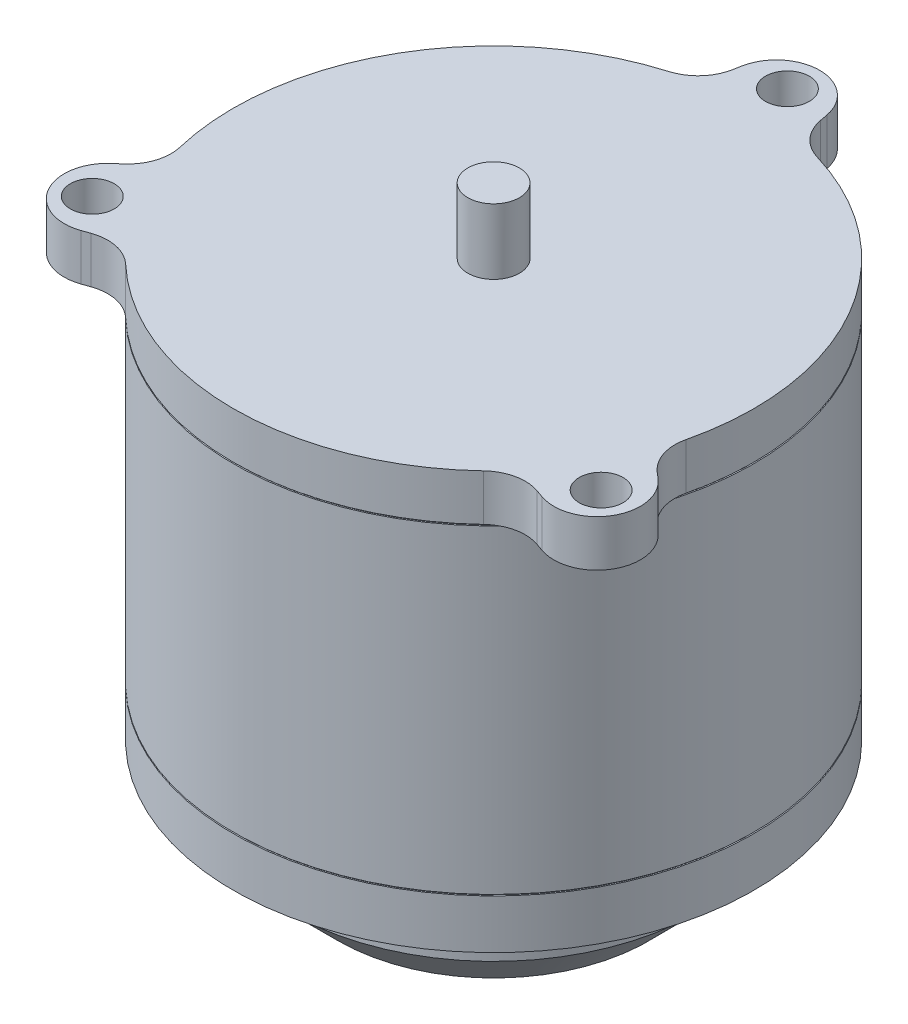
ISO-10303-21;
HEADER;
FILE_DESCRIPTION(('STEP AP214'),'2;1');
FILE_NAME('part.step','',(''),(''),'','','');
FILE_SCHEMA(('AUTOMOTIVE_DESIGN { 1 0 10303 214 1 1 1 1 }'));
ENDSEC;
DATA;
#1=APPLICATION_CONTEXT('core data for automotive mechanical design processes');
#2=APPLICATION_PROTOCOL_DEFINITION('international standard','automotive_design',2000,#1);
#3=PRODUCT_CONTEXT('',#1,'mechanical');
#4=PRODUCT('Part','Part','',(#3));
#5=PRODUCT_RELATED_PRODUCT_CATEGORY('part','',(#4));
#6=PRODUCT_DEFINITION_FORMATION('','',#4);
#7=PRODUCT_DEFINITION_CONTEXT('part definition',#1,'design');
#8=PRODUCT_DEFINITION('design','',#6,#7);
#9=PRODUCT_DEFINITION_SHAPE('','',#8);
#10=(LENGTH_UNIT() NAMED_UNIT(*) SI_UNIT(.MILLI.,.METRE.));
#11=(NAMED_UNIT(*) PLANE_ANGLE_UNIT() SI_UNIT($,.RADIAN.));
#12=(NAMED_UNIT(*) SI_UNIT($,.STERADIAN.) SOLID_ANGLE_UNIT());
#13=UNCERTAINTY_MEASURE_WITH_UNIT(LENGTH_MEASURE(1.E-05),#10,'distance_accuracy_value','');
#14=(GEOMETRIC_REPRESENTATION_CONTEXT(3) GLOBAL_UNCERTAINTY_ASSIGNED_CONTEXT((#13)) GLOBAL_UNIT_ASSIGNED_CONTEXT((#10,
#11,#12)) REPRESENTATION_CONTEXT('',''));
#15=CARTESIAN_POINT('',(0.,0.,0.));
#16=DIRECTION('',(0.,0.,1.));
#17=DIRECTION('',(1.,0.,0.));
#18=AXIS2_PLACEMENT_3D('',#15,#16,#17);
#19=CARTESIAN_POINT('',(0.,87.6404386780612,-54.8512258888761));
#20=DIRECTION('',(0.,-1.,0.));
#21=DIRECTION('',(0.,0.,-1.));
#22=AXIS2_PLACEMENT_3D('',#19,#20,#21);
#23=PLANE('',#22);
#24=CARTESIAN_POINT('',(0.,87.6404386780612,-57.));
#25=DIRECTION('',(0.,1.,0.));
#26=DIRECTION('',(0.,0.,1.));
#27=AXIS2_PLACEMENT_3D('',#24,#25,#26);
#28=CIRCLE('',#27,4.25);
#29=CARTESIAN_POINT('',(0.,87.6404386780612,-52.75));
#30=VERTEX_POINT('',#29);
#31=EDGE_CURVE('E235',#30,#30,#28,.T.);
#32=ORIENTED_EDGE('',*,*,#31,.F.);
#33=EDGE_LOOP('',(#32));
#34=FACE_BOUND('',#33,.T.);
#35=CARTESIAN_POINT('',(49.3634480157129,87.6404386780612,28.5000000000002));
#36=DIRECTION('',(0.,1.,0.));
#37=DIRECTION('',(-0.866025403784436,0.,-0.500000000000004));
#38=AXIS2_PLACEMENT_3D('',#35,#36,#37);
#39=CIRCLE('',#38,4.25);
#40=CARTESIAN_POINT('',(45.682840049629,87.6404386780612,26.3750000000002));
#41=VERTEX_POINT('',#40);
#42=EDGE_CURVE('E188',#41,#41,#39,.T.);
#43=ORIENTED_EDGE('',*,*,#42,.F.);
#44=EDGE_LOOP('',(#43));
#45=FACE_BOUND('',#44,.T.);
#46=CARTESIAN_POINT('',(-49.3634480157133,87.6404386780612,28.4999999999995));
#47=DIRECTION('',(0.,1.,0.));
#48=DIRECTION('',(0.866025403784443,0.,-0.499999999999992));
#49=AXIS2_PLACEMENT_3D('',#46,#47,#48);
#50=CIRCLE('',#49,4.25);
#51=CARTESIAN_POINT('',(-45.6828400496294,87.6404386780612,26.3749999999996));
#52=VERTEX_POINT('',#51);
#53=EDGE_CURVE('E730',#52,#52,#50,.T.);
#54=ORIENTED_EDGE('',*,*,#53,.F.);
#55=EDGE_LOOP('',(#54));
#56=FACE_BOUND('',#55,.T.);
#57=CARTESIAN_POINT('',(0.,87.6404386780612,0.));
#58=DIRECTION('',(0.,1.,0.));
#59=DIRECTION('',(0.,0.,1.));
#60=AXIS2_PLACEMENT_3D('',#57,#58,#59);
#61=CIRCLE('',#60,50.5);
#62=CARTESIAN_POINT('',(49.1147451958564,87.6404386780612,11.7469912890961));
#63=VERTEX_POINT('',#62);
#64=CARTESIAN_POINT('',(14.3841797235366,87.6404386780612,-48.4081126845594));
#65=VERTEX_POINT('',#64);
#66=EDGE_CURVE('E49',#63,#65,#61,.T.);
#67=ORIENTED_EDGE('',*,*,#66,.T.);
#68=CARTESIAN_POINT('',(16.7741070451743,87.6404386780612,-56.4511066763847));
#69=DIRECTION('',(0.,-1.,0.));
#70=DIRECTION('',(0.,0.,1.));
#71=AXIS2_PLACEMENT_3D('',#68,#69,#70);
#72=CIRCLE('',#71,8.3905604672899);
#73=CARTESIAN_POINT('',(8.52778948386526,87.6404386780612,-54.9019934999852));
#74=VERTEX_POINT('',#73);
#75=EDGE_CURVE('E252',#65,#74,#72,.T.);
#76=ORIENTED_EDGE('',*,*,#75,.T.);
#77=DIRECTION('',(-0.184625709145247,0.,-0.982808906920676));
#78=VECTOR('',#77,1.);
#79=CARTESIAN_POINT('',(8.52778948386527,87.6404386780612,-54.9019934999852));
#80=LINE('',#79,#78);
#81=CARTESIAN_POINT('',(8.24631756130902,87.6404386780612,-56.4003390652756));
#82=VERTEX_POINT('',#81);
#83=EDGE_CURVE('E255',#74,#82,#80,.T.);
#84=ORIENTED_EDGE('',*,*,#83,.T.);
#85=CARTESIAN_POINT('',(0.,87.6404386780612,-54.8512258888761));
#86=DIRECTION('',(0.,1.,0.));
#87=DIRECTION('',(0.,0.,-1.));
#88=AXIS2_PLACEMENT_3D('',#85,#86,#87);
#89=CIRCLE('',#88,8.39056046728989);
#90=CARTESIAN_POINT('',(-8.24631756130901,87.6404386780612,-56.4003390652755));
#91=VERTEX_POINT('',#90);
#92=EDGE_CURVE('E241',#82,#91,#89,.T.);
#93=ORIENTED_EDGE('',*,*,#92,.T.);
#94=DIRECTION('',(-0.184625709145246,0.,0.982808906920677));
#95=VECTOR('',#94,1.);
#96=CARTESIAN_POINT('',(-8.24631756130901,87.6404386780612,-56.4003390652755));
#97=LINE('',#96,#95);
#98=CARTESIAN_POINT('',(-8.52778948386525,87.6404386780612,-54.9019934999852));
#99=VERTEX_POINT('',#98);
#100=EDGE_CURVE('E244',#91,#99,#97,.T.);
#101=ORIENTED_EDGE('',*,*,#100,.T.);
#102=CARTESIAN_POINT('',(-16.7741070451743,87.6404386780612,-56.4511066763847));
#103=DIRECTION('',(0.,-1.,0.));
#104=DIRECTION('',(0.,0.,-1.));
#105=AXIS2_PLACEMENT_3D('',#102,#103,#104);
#106=CIRCLE('',#105,8.3905604672899);
#107=CARTESIAN_POINT('',(-14.3841797235367,87.6404386780612,-48.4081126845594));
#108=VERTEX_POINT('',#107);
#109=EDGE_CURVE('E247',#99,#108,#106,.T.);
#110=ORIENTED_EDGE('',*,*,#109,.T.);
#111=CARTESIAN_POINT('',(-49.1147451958566,87.6404386780612,11.7469912890955));
#112=VERTEX_POINT('',#111);
#113=EDGE_CURVE('E249',#108,#112,#61,.T.);
#114=ORIENTED_EDGE('',*,*,#113,.T.);
#115=CARTESIAN_POINT('',(-57.2751459760817,87.6404386780612,13.6987505112713));
#116=DIRECTION('',(0.,-1.,0.));
#117=DIRECTION('',(0.866025403784443,0.,-0.499999999999992));
#118=AXIS2_PLACEMENT_3D('',#115,#116,#117);
#119=CIRCLE('',#118,8.3905604672899);
#120=CARTESIAN_POINT('',(-51.8104158313281,87.6404386780612,20.065714418839));
#121=VERTEX_POINT('',#120);
#122=EDGE_CURVE('E718',#112,#121,#119,.T.);
#123=ORIENTED_EDGE('',*,*,#122,.T.);
#124=DIRECTION('',(-0.758824625886304,0.,0.651295007771832));
#125=VECTOR('',#124,1.);
#126=CARTESIAN_POINT('',(-51.8104158313281,87.6404386780612,20.065714418839));
#127=LINE('',#126,#125);
#128=CARTESIAN_POINT('',(-52.9672851932392,87.6404386780612,21.0586490368699));
#129=VERTEX_POINT('',#128);
#130=EDGE_CURVE('E176',#121,#129,#127,.T.);
#131=ORIENTED_EDGE('',*,*,#130,.T.);
#132=CARTESIAN_POINT('',(-47.5025550484856,87.6404386780612,27.4256129444376));
#133=DIRECTION('',(0.,1.,0.));
#134=DIRECTION('',(-0.866025403784443,0.,0.499999999999992));
#135=AXIS2_PLACEMENT_3D('',#132,#133,#134);
#136=CIRCLE('',#135,8.39056046728989);
#137=CARTESIAN_POINT('',(-44.7209676319303,87.6404386780612,35.3416900284047));
#138=VERTEX_POINT('',#137);
#139=EDGE_CURVE('E171',#129,#138,#136,.T.);
#140=ORIENTED_EDGE('',*,*,#139,.T.);
#141=DIRECTION('',(0.943450335031548,0.,-0.33151389914883));
#142=VECTOR('',#141,1.);
#143=CARTESIAN_POINT('',(-44.7209676319303,87.6404386780612,35.3416900284047));
#144=LINE('',#143,#142);
#145=CARTESIAN_POINT('',(-43.282626347463,87.6404386780612,34.8362790811453));
#146=VERTEX_POINT('',#145);
#147=EDGE_CURVE('E159',#138,#146,#144,.T.);
#148=ORIENTED_EDGE('',*,*,#147,.T.);
#149=CARTESIAN_POINT('',(-40.5010389309077,87.6404386780612,42.7523561651124));
#150=DIRECTION('',(0.,-1.,0.));
#151=DIRECTION('',(-0.866025403784443,0.,0.499999999999992));
#152=AXIS2_PLACEMENT_3D('',#149,#150,#151);
#153=CIRCLE('',#152,8.3905604672899);
#154=CARTESIAN_POINT('',(-34.7305654723201,87.6404386780612,36.6611213954631));
#155=VERTEX_POINT('',#154);
#156=EDGE_CURVE('E170',#146,#155,#153,.T.);
#157=ORIENTED_EDGE('',*,*,#156,.T.);
#158=CARTESIAN_POINT('',(34.7305654723196,87.6404386780612,36.6611213954636));
#159=VERTEX_POINT('',#158);
#160=EDGE_CURVE('E253',#155,#159,#61,.T.);
#161=ORIENTED_EDGE('',*,*,#160,.T.);
#162=CARTESIAN_POINT('',(40.5010389309071,87.6404386780612,42.752356165113));
#163=DIRECTION('',(0.,-1.,0.));
#164=DIRECTION('',(-0.866025403784436,0.,-0.500000000000004));
#165=AXIS2_PLACEMENT_3D('',#162,#163,#164);
#166=CIRCLE('',#165,8.3905604672899);
#167=CARTESIAN_POINT('',(43.2826263474625,87.6404386780612,34.8362790811459));
#168=VERTEX_POINT('',#167);
#169=EDGE_CURVE('E205',#159,#168,#166,.T.);
#170=ORIENTED_EDGE('',*,*,#169,.T.);
#171=DIRECTION('',(0.943450335031544,0.,0.331513899148842));
#172=VECTOR('',#171,1.);
#173=CARTESIAN_POINT('',(43.2826263474625,87.6404386780612,34.8362790811459));
#174=LINE('',#173,#172);
#175=CARTESIAN_POINT('',(44.7209676319298,87.6404386780612,35.3416900284053));
#176=VERTEX_POINT('',#175);
#177=EDGE_CURVE('E207',#168,#176,#174,.T.);
#178=ORIENTED_EDGE('',*,*,#177,.T.);
#179=CARTESIAN_POINT('',(47.5025550484853,87.6404386780612,27.4256129444383));
#180=DIRECTION('',(0.,1.,0.));
#181=DIRECTION('',(0.866025403784436,0.,0.500000000000004));
#182=AXIS2_PLACEMENT_3D('',#179,#180,#181);
#183=CIRCLE('',#182,8.39056046728989);
#184=CARTESIAN_POINT('',(52.9672851932389,87.6404386780612,21.0586490368707));
#185=VERTEX_POINT('',#184);
#186=EDGE_CURVE('E197',#176,#185,#183,.T.);
#187=ORIENTED_EDGE('',*,*,#186,.T.);
#188=DIRECTION('',(-0.758824625886296,0.,-0.651295007771842));
#189=VECTOR('',#188,1.);
#190=CARTESIAN_POINT('',(52.9672851932389,87.6404386780612,21.0586490368707));
#191=LINE('',#190,#189);
#192=CARTESIAN_POINT('',(51.8104158313279,87.6404386780612,20.0657144188398));
#193=VERTEX_POINT('',#192);
#194=EDGE_CURVE('E200',#185,#193,#191,.T.);
#195=ORIENTED_EDGE('',*,*,#194,.T.);
#196=CARTESIAN_POINT('',(57.2751459760815,87.6404386780612,13.6987505112721));
#197=DIRECTION('',(0.,-1.,0.));
#198=DIRECTION('',(0.866025403784436,0.,0.500000000000004));
#199=AXIS2_PLACEMENT_3D('',#196,#197,#198);
#200=CIRCLE('',#199,8.3905604672899);
#201=EDGE_CURVE('E203',#193,#63,#200,.T.);
#202=ORIENTED_EDGE('',*,*,#201,.T.);
#203=EDGE_LOOP('',(#67,#76,#84,#93,#101,#110,#114,#123,#131,#140,#148,#157,#161,#170,#178,#187,
#195,#202));
#204=FACE_BOUND('',#203,.T.);
#205=CARTESIAN_POINT('',(0.,87.6404386780612,0.));
#206=DIRECTION('',(0.,-1.,0.));
#207=DIRECTION('',(0.,0.,-1.));
#208=AXIS2_PLACEMENT_3D('',#205,#206,#207);
#209=CIRCLE('',#208,5.);
#210=CARTESIAN_POINT('',(0.,87.6404386780612,-5.));
#211=VERTEX_POINT('',#210);
#212=EDGE_CURVE('E11',#211,#211,#209,.F.);
#213=ORIENTED_EDGE('',*,*,#212,.F.);
#214=EDGE_LOOP('',(#213));
#215=FACE_BOUND('',#214,.T.);
#216=ADVANCED_FACE('F34',(#34,#45,#56,#204,#215),#23,.F.);
#217=CARTESIAN_POINT('',(0.,87.6404386780612,0.));
#218=DIRECTION('',(0.,-1.,0.));
#219=DIRECTION('',(0.,0.,-1.));
#220=AXIS2_PLACEMENT_3D('',#217,#218,#219);
#221=CYLINDRICAL_SURFACE('',#220,50.5);
#222=DIRECTION('',(0.,-1.,0.));
#223=VECTOR('',#222,1.);
#224=CARTESIAN_POINT('',(34.7305654723197,87.6404386780612,36.6611213954636));
#225=LINE('',#224,#223);
#226=CARTESIAN_POINT('',(34.7305654723197,78.6404386780612,36.6611213954636));
#227=VERTEX_POINT('',#226);
#228=EDGE_CURVE('E57',#159,#227,#225,.T.);
#229=ORIENTED_EDGE('',*,*,#228,.F.);
#230=ORIENTED_EDGE('',*,*,#160,.F.);
#231=DIRECTION('',(0.,-1.,0.));
#232=VECTOR('',#231,1.);
#233=CARTESIAN_POINT('',(-34.7305654723201,87.6404386780612,36.6611213954631));
#234=LINE('',#233,#232);
#235=CARTESIAN_POINT('',(-34.7305654723201,78.6404386780612,36.6611213954631));
#236=VERTEX_POINT('',#235);
#237=EDGE_CURVE('E190',#155,#236,#234,.T.);
#238=ORIENTED_EDGE('',*,*,#237,.T.);
#239=CARTESIAN_POINT('',(0.,78.6404386780612,0.));
#240=DIRECTION('',(0.,1.,0.));
#241=DIRECTION('',(0.,0.,1.));
#242=AXIS2_PLACEMENT_3D('',#239,#240,#241);
#243=CIRCLE('',#242,50.5);
#244=EDGE_CURVE('E268',#236,#227,#243,.T.);
#245=ORIENTED_EDGE('',*,*,#244,.T.);
#246=EDGE_LOOP('',(#229,#230,#238,#245));
#247=FACE_BOUND('',#246,.T.);
#248=ADVANCED_FACE('F340',(#247),#221,.T.);
#249=DIRECTION('',(0.,-1.,0.));
#250=VECTOR('',#249,1.);
#251=CARTESIAN_POINT('',(-49.1147451958566,87.6404386780612,11.7469912890955));
#252=LINE('',#251,#250);
#253=CARTESIAN_POINT('',(-49.1147451958566,78.6404386780612,11.7469912890955));
#254=VERTEX_POINT('',#253);
#255=EDGE_CURVE('E712',#112,#254,#252,.T.);
#256=ORIENTED_EDGE('',*,*,#255,.F.);
#257=ORIENTED_EDGE('',*,*,#113,.F.);
#258=DIRECTION('',(0.,-1.,0.));
#259=VECTOR('',#258,1.);
#260=CARTESIAN_POINT('',(-14.3841797235367,87.6404386780612,-48.4081126845594));
#261=LINE('',#260,#259);
#262=CARTESIAN_POINT('',(-14.3841797235367,78.6404386780612,-48.4081126845594));
#263=VERTEX_POINT('',#262);
#264=EDGE_CURVE('E279',#108,#263,#261,.T.);
#265=ORIENTED_EDGE('',*,*,#264,.T.);
#266=EDGE_CURVE('E265',#263,#254,#243,.T.);
#267=ORIENTED_EDGE('',*,*,#266,.T.);
#268=EDGE_LOOP('',(#256,#257,#265,#267));
#269=FACE_BOUND('',#268,.T.);
#270=ADVANCED_FACE('F338',(#269),#221,.T.);
#271=CARTESIAN_POINT('',(0.,-19.8872925243569,0.));
#272=DIRECTION('',(0.,-1.,0.));
#273=DIRECTION('',(0.,0.,-1.));
#274=AXIS2_PLACEMENT_3D('',#271,#272,#273);
#275=PLANE('',#274);
#276=CARTESIAN_POINT('',(0.,-19.8872925243569,0.));
#277=DIRECTION('',(0.,-1.,0.));
#278=DIRECTION('',(0.,0.,-1.));
#279=AXIS2_PLACEMENT_3D('',#276,#277,#278);
#280=CIRCLE('',#279,16.);
#281=CARTESIAN_POINT('',(0.,-19.8872925243569,-16.));
#282=VERTEX_POINT('',#281);
#283=EDGE_CURVE('E42',#282,#282,#280,.T.);
#284=ORIENTED_EDGE('',*,*,#283,.T.);
#285=EDGE_LOOP('',(#284));
#286=FACE_BOUND('',#285,.T.);
#287=ADVANCED_FACE('F36',(#286),#275,.T.);
#288=CARTESIAN_POINT('',(0.,-28.529868612867,0.));
#289=DIRECTION('',(0.,-1.,0.));
#290=DIRECTION('',(0.,0.,-1.));
#291=AXIS2_PLACEMENT_3D('',#288,#289,#290);
#292=CYLINDRICAL_SURFACE('',#291,16.);
#293=CARTESIAN_POINT('',(0.,-11.9497925243569,0.));
#294=DIRECTION('',(0.,-1.,0.));
#295=DIRECTION('',(0.,0.,-1.));
#296=AXIS2_PLACEMENT_3D('',#293,#294,#295);
#297=CIRCLE('',#296,16.);
#298=CARTESIAN_POINT('',(0.,-11.9497925243569,-16.));
#299=VERTEX_POINT('',#298);
#300=EDGE_CURVE('E321',#299,#299,#297,.T.);
#301=ORIENTED_EDGE('',*,*,#300,.T.);
#302=EDGE_LOOP('',(#301));
#303=FACE_BOUND('',#302,.T.);
#304=ORIENTED_EDGE('',*,*,#283,.F.);
#305=EDGE_LOOP('',(#304));
#306=FACE_BOUND('',#305,.T.);
#307=ADVANCED_FACE('F327',(#303,#306),#292,.T.);
#308=CARTESIAN_POINT('',(16.,-11.9497925243569,0.));
#309=DIRECTION('',(0.,-1.,0.));
#310=DIRECTION('',(0.,0.,-1.));
#311=AXIS2_PLACEMENT_3D('',#308,#309,#310);
#312=PLANE('',#311);
#313=CARTESIAN_POINT('',(0.,-11.9497925243569,0.));
#314=DIRECTION('',(0.,-1.,0.));
#315=DIRECTION('',(0.,0.,-1.));
#316=AXIS2_PLACEMENT_3D('',#313,#314,#315);
#317=CIRCLE('',#316,30.1625);
#318=CARTESIAN_POINT('',(0.,-11.9497925243569,-30.1625));
#319=VERTEX_POINT('',#318);
#320=EDGE_CURVE('E318',#319,#319,#317,.T.);
#321=ORIENTED_EDGE('',*,*,#320,.T.);
#322=EDGE_LOOP('',(#321));
#323=FACE_BOUND('',#322,.T.);
#324=ORIENTED_EDGE('',*,*,#300,.F.);
#325=EDGE_LOOP('',(#324));
#326=FACE_BOUND('',#325,.T.);
#327=ADVANCED_FACE('F329',(#323,#326),#312,.T.);
#328=CARTESIAN_POINT('',(0.,-11.9497925243569,0.));
#329=DIRECTION('',(0.,1.,0.));
#330=DIRECTION('',(0.,0.,1.));
#331=AXIS2_PLACEMENT_3D('',#328,#329,#330);
#332=CONICAL_SURFACE('',#331,30.1625,0.785398163397447);
#333=CARTESIAN_POINT('',(0.,-2.4247925243569,0.));
#334=DIRECTION('',(0.,-1.,0.));
#335=DIRECTION('',(0.,0.,-1.));
#336=AXIS2_PLACEMENT_3D('',#333,#334,#335);
#337=CIRCLE('',#336,39.6875);
#338=CARTESIAN_POINT('',(0.,-2.4247925243569,-39.6875));
#339=VERTEX_POINT('',#338);
#340=EDGE_CURVE('E315',#339,#339,#337,.T.);
#341=ORIENTED_EDGE('',*,*,#340,.T.);
#342=EDGE_LOOP('',(#341));
#343=FACE_BOUND('',#342,.T.);
#344=ORIENTED_EDGE('',*,*,#320,.F.);
#345=EDGE_LOOP('',(#344));
#346=FACE_BOUND('',#345,.T.);
#347=ADVANCED_FACE('F335',(#343,#346),#332,.T.);
#348=CARTESIAN_POINT('',(0.,-28.529868612867,0.));
#349=DIRECTION('',(0.,-1.,0.));
#350=DIRECTION('',(0.,0.,-1.));
#351=AXIS2_PLACEMENT_3D('',#348,#349,#350);
#352=CYLINDRICAL_SURFACE('',#351,39.6875);
#353=CARTESIAN_POINT('',(0.,6.69493867806119,0.));
#354=DIRECTION('',(0.,-1.,0.));
#355=DIRECTION('',(0.,0.,-1.));
#356=AXIS2_PLACEMENT_3D('',#353,#354,#355);
#357=CIRCLE('',#356,39.6875);
#358=CARTESIAN_POINT('',(0.,6.69493867806119,-39.6875));
#359=VERTEX_POINT('',#358);
#360=EDGE_CURVE('E312',#359,#359,#357,.T.);
#361=ORIENTED_EDGE('',*,*,#360,.T.);
#362=EDGE_LOOP('',(#361));
#363=FACE_BOUND('',#362,.T.);
#364=ORIENTED_EDGE('',*,*,#340,.F.);
#365=EDGE_LOOP('',(#364));
#366=FACE_BOUND('',#365,.T.);
#367=ADVANCED_FACE('F410',(#363,#366),#352,.T.);
#368=CARTESIAN_POINT('',(39.6875,6.69493867806118,0.));
#369=DIRECTION('',(0.,-1.,0.));
#370=DIRECTION('',(0.,0.,-1.));
#371=AXIS2_PLACEMENT_3D('',#368,#369,#370);
#372=PLANE('',#371);
#373=CARTESIAN_POINT('',(0.,6.69493867806119,0.));
#374=DIRECTION('',(0.,-1.,0.));
#375=DIRECTION('',(0.,0.,-1.));
#376=AXIS2_PLACEMENT_3D('',#373,#374,#375);
#377=CIRCLE('',#376,50.5);
#378=CARTESIAN_POINT('',(0.,6.69493867806119,-50.5));
#379=VERTEX_POINT('',#378);
#380=EDGE_CURVE('E309',#379,#379,#377,.T.);
#381=ORIENTED_EDGE('',*,*,#380,.T.);
#382=EDGE_LOOP('',(#381));
#383=FACE_BOUND('',#382,.T.);
#384=ORIENTED_EDGE('',*,*,#360,.F.);
#385=EDGE_LOOP('',(#384));
#386=FACE_BOUND('',#385,.T.);
#387=ADVANCED_FACE('F406',(#383,#386),#372,.T.);
#388=CARTESIAN_POINT('',(0.,-28.529868612867,0.));
#389=DIRECTION('',(0.,-1.,0.));
#390=DIRECTION('',(0.,0.,-1.));
#391=AXIS2_PLACEMENT_3D('',#388,#389,#390);
#392=CYLINDRICAL_SURFACE('',#391,50.5);
#393=CARTESIAN_POINT('',(0.,16.2199386780612,0.));
#394=DIRECTION('',(0.,-1.,0.));
#395=DIRECTION('',(0.,0.,-1.));
#396=AXIS2_PLACEMENT_3D('',#393,#394,#395);
#397=CIRCLE('',#396,50.5);
#398=CARTESIAN_POINT('',(0.,16.2199386780612,-50.5));
#399=VERTEX_POINT('',#398);
#400=EDGE_CURVE('E306',#399,#399,#397,.T.);
#401=ORIENTED_EDGE('',*,*,#400,.T.);
#402=EDGE_LOOP('',(#401));
#403=FACE_BOUND('',#402,.T.);
#404=ORIENTED_EDGE('',*,*,#380,.F.);
#405=EDGE_LOOP('',(#404));
#406=FACE_BOUND('',#405,.T.);
#407=ADVANCED_FACE('F402',(#403,#406),#392,.T.);
#408=CARTESIAN_POINT('',(50.5,16.2199386780612,0.));
#409=DIRECTION('',(0.,1.,0.));
#410=DIRECTION('',(0.,0.,1.));
#411=AXIS2_PLACEMENT_3D('',#408,#409,#410);
#412=PLANE('',#411);
#413=CARTESIAN_POINT('',(0.,16.2199386780612,0.));
#414=DIRECTION('',(0.,-1.,0.));
#415=DIRECTION('',(0.,0.,-1.));
#416=AXIS2_PLACEMENT_3D('',#413,#414,#415);
#417=CIRCLE('',#416,50.246);
#418=CARTESIAN_POINT('',(0.,16.2199386780612,-50.246));
#419=VERTEX_POINT('',#418);
#420=EDGE_CURVE('E303',#419,#419,#417,.T.);
#421=ORIENTED_EDGE('',*,*,#420,.T.);
#422=EDGE_LOOP('',(#421));
#423=FACE_BOUND('',#422,.T.);
#424=ORIENTED_EDGE('',*,*,#400,.F.);
#425=EDGE_LOOP('',(#424));
#426=FACE_BOUND('',#425,.T.);
#427=ADVANCED_FACE('F398',(#423,#426),#412,.T.);
#428=CARTESIAN_POINT('',(0.,-28.529868612867,0.));
#429=DIRECTION('',(0.,-1.,0.));
#430=DIRECTION('',(0.,0.,-1.));
#431=AXIS2_PLACEMENT_3D('',#428,#429,#430);
#432=CYLINDRICAL_SURFACE('',#431,50.246);
#433=CARTESIAN_POINT('',(0.,16.4739386780612,0.));
#434=DIRECTION('',(0.,-1.,0.));
#435=DIRECTION('',(0.,0.,-1.));
#436=AXIS2_PLACEMENT_3D('',#433,#434,#435);
#437=CIRCLE('',#436,50.246);
#438=CARTESIAN_POINT('',(0.,16.4739386780612,-50.246));
#439=VERTEX_POINT('',#438);
#440=EDGE_CURVE('E300',#439,#439,#437,.T.);
#441=ORIENTED_EDGE('',*,*,#440,.T.);
#442=EDGE_LOOP('',(#441));
#443=FACE_BOUND('',#442,.T.);
#444=ORIENTED_EDGE('',*,*,#420,.F.);
#445=EDGE_LOOP('',(#444));
#446=FACE_BOUND('',#445,.T.);
#447=ADVANCED_FACE('F394',(#443,#446),#432,.T.);
#448=CARTESIAN_POINT('',(50.246,16.4739386780612,0.));
#449=DIRECTION('',(0.,-1.,0.));
#450=DIRECTION('',(0.,0.,-1.));
#451=AXIS2_PLACEMENT_3D('',#448,#449,#450);
#452=PLANE('',#451);
#453=CARTESIAN_POINT('',(0.,16.4739386780612,0.));
#454=DIRECTION('',(0.,-1.,0.));
#455=DIRECTION('',(0.,0.,-1.));
#456=AXIS2_PLACEMENT_3D('',#453,#454,#455);
#457=CIRCLE('',#456,50.5);
#458=CARTESIAN_POINT('',(0.,16.4739386780612,-50.5));
#459=VERTEX_POINT('',#458);
#460=EDGE_CURVE('E297',#459,#459,#457,.T.);
#461=ORIENTED_EDGE('',*,*,#460,.T.);
#462=EDGE_LOOP('',(#461));
#463=FACE_BOUND('',#462,.T.);
#464=ORIENTED_EDGE('',*,*,#440,.F.);
#465=EDGE_LOOP('',(#464));
#466=FACE_BOUND('',#465,.T.);
#467=ADVANCED_FACE('F390',(#463,#466),#452,.T.);
#468=CARTESIAN_POINT('',(0.,-28.529868612867,0.));
#469=DIRECTION('',(0.,-1.,0.));
#470=DIRECTION('',(0.,0.,-1.));
#471=AXIS2_PLACEMENT_3D('',#468,#469,#470);
#472=CYLINDRICAL_SURFACE('',#471,50.5);
#473=CARTESIAN_POINT('',(0.,78.3864386780612,0.));
#474=DIRECTION('',(0.,-1.,0.));
#475=DIRECTION('',(0.,0.,-1.));
#476=AXIS2_PLACEMENT_3D('',#473,#474,#475);
#477=CIRCLE('',#476,50.5);
#478=CARTESIAN_POINT('',(0.,78.3864386780612,-50.5));
#479=VERTEX_POINT('',#478);
#480=EDGE_CURVE('E294',#479,#479,#477,.T.);
#481=ORIENTED_EDGE('',*,*,#480,.T.);
#482=EDGE_LOOP('',(#481));
#483=FACE_BOUND('',#482,.T.);
#484=ORIENTED_EDGE('',*,*,#460,.F.);
#485=EDGE_LOOP('',(#484));
#486=FACE_BOUND('',#485,.T.);
#487=ADVANCED_FACE('F386',(#483,#486),#472,.T.);
#488=CARTESIAN_POINT('',(50.5,78.3864386780612,0.));
#489=DIRECTION('',(0.,1.,0.));
#490=DIRECTION('',(0.,0.,1.));
#491=AXIS2_PLACEMENT_3D('',#488,#489,#490);
#492=PLANE('',#491);
#493=CARTESIAN_POINT('',(0.,78.3864386780612,0.));
#494=DIRECTION('',(0.,-1.,0.));
#495=DIRECTION('',(0.,0.,-1.));
#496=AXIS2_PLACEMENT_3D('',#493,#494,#495);
#497=CIRCLE('',#496,50.246);
#498=CARTESIAN_POINT('',(0.,78.3864386780612,-50.246));
#499=VERTEX_POINT('',#498);
#500=EDGE_CURVE('E291',#499,#499,#497,.T.);
#501=ORIENTED_EDGE('',*,*,#500,.T.);
#502=EDGE_LOOP('',(#501));
#503=FACE_BOUND('',#502,.T.);
#504=ORIENTED_EDGE('',*,*,#480,.F.);
#505=EDGE_LOOP('',(#504));
#506=FACE_BOUND('',#505,.T.);
#507=ADVANCED_FACE('F382',(#503,#506),#492,.T.);
#508=CARTESIAN_POINT('',(0.,-28.529868612867,0.));
#509=DIRECTION('',(0.,-1.,0.));
#510=DIRECTION('',(0.,0.,-1.));
#511=AXIS2_PLACEMENT_3D('',#508,#509,#510);
#512=CYLINDRICAL_SURFACE('',#511,50.246);
#513=CARTESIAN_POINT('',(0.,78.6404386780612,0.));
#514=DIRECTION('',(0.,-1.,0.));
#515=DIRECTION('',(0.,0.,-1.));
#516=AXIS2_PLACEMENT_3D('',#513,#514,#515);
#517=CIRCLE('',#516,50.246);
#518=CARTESIAN_POINT('',(0.,78.6404386780612,-50.246));
#519=VERTEX_POINT('',#518);
#520=EDGE_CURVE('E288',#519,#519,#517,.F.);
#521=ORIENTED_EDGE('',*,*,#520,.F.);
#522=EDGE_LOOP('',(#521));
#523=FACE_BOUND('',#522,.T.);
#524=ORIENTED_EDGE('',*,*,#500,.F.);
#525=EDGE_LOOP('',(#524));
#526=FACE_BOUND('',#525,.T.);
#527=ADVANCED_FACE('F358',(#523,#526),#512,.T.);
#528=CARTESIAN_POINT('',(0.,78.6404386780612,-54.8512258888761));
#529=DIRECTION('',(0.,-1.,0.));
#530=DIRECTION('',(0.,0.,-1.));
#531=AXIS2_PLACEMENT_3D('',#528,#529,#530);
#532=PLANE('',#531);
#533=ORIENTED_EDGE('',*,*,#266,.F.);
#534=CARTESIAN_POINT('',(-16.7741070451743,78.6404386780612,-56.4511066763847));
#535=DIRECTION('',(0.,-1.,0.));
#536=DIRECTION('',(0.,0.,-1.));
#537=AXIS2_PLACEMENT_3D('',#534,#535,#536);
#538=CIRCLE('',#537,8.3905604672899);
#539=CARTESIAN_POINT('',(-8.52778948386525,78.6404386780612,-54.9019934999852));
#540=VERTEX_POINT('',#539);
#541=EDGE_CURVE('E262',#540,#263,#538,.T.);
#542=ORIENTED_EDGE('',*,*,#541,.F.);
#543=DIRECTION('',(-0.184625709145246,0.,0.982808906920677));
#544=VECTOR('',#543,1.);
#545=CARTESIAN_POINT('',(-8.24631756130901,78.6404386780612,-56.4003390652755));
#546=LINE('',#545,#544);
#547=CARTESIAN_POINT('',(-8.24631756130901,78.6404386780612,-56.4003390652755));
#548=VERTEX_POINT('',#547);
#549=EDGE_CURVE('E260',#548,#540,#546,.T.);
#550=ORIENTED_EDGE('',*,*,#549,.F.);
#551=CARTESIAN_POINT('',(0.,78.6404386780612,-54.8512258888761));
#552=DIRECTION('',(0.,1.,0.));
#553=DIRECTION('',(0.,0.,-1.));
#554=AXIS2_PLACEMENT_3D('',#551,#552,#553);
#555=CIRCLE('',#554,8.39056046728989);
#556=CARTESIAN_POINT('',(8.24631756130902,78.6404386780612,-56.4003390652756));
#557=VERTEX_POINT('',#556);
#558=EDGE_CURVE('E238',#557,#548,#555,.T.);
#559=ORIENTED_EDGE('',*,*,#558,.F.);
#560=DIRECTION('',(-0.184625709145247,0.,-0.982808906920676));
#561=VECTOR('',#560,1.);
#562=CARTESIAN_POINT('',(8.52778948386527,78.6404386780612,-54.9019934999852));
#563=LINE('',#562,#561);
#564=CARTESIAN_POINT('',(8.52778948386526,78.6404386780612,-54.9019934999852));
#565=VERTEX_POINT('',#564);
#566=EDGE_CURVE('E245',#565,#557,#563,.T.);
#567=ORIENTED_EDGE('',*,*,#566,.F.);
#568=CARTESIAN_POINT('',(16.7741070451743,78.6404386780612,-56.4511066763847));
#569=DIRECTION('',(0.,-1.,0.));
#570=DIRECTION('',(0.,0.,1.));
#571=AXIS2_PLACEMENT_3D('',#568,#569,#570);
#572=CIRCLE('',#571,8.3905604672899);
#573=CARTESIAN_POINT('',(14.3841797235366,78.6404386780612,-48.4081126845594));
#574=VERTEX_POINT('',#573);
#575=EDGE_CURVE('E267',#574,#565,#572,.T.);
#576=ORIENTED_EDGE('',*,*,#575,.F.);
#577=CARTESIAN_POINT('',(49.1147451958564,78.6404386780612,11.7469912890961));
#578=VERTEX_POINT('',#577);
#579=EDGE_CURVE('E264',#578,#574,#243,.T.);
#580=ORIENTED_EDGE('',*,*,#579,.F.);
#581=CARTESIAN_POINT('',(57.2751459760815,78.6404386780612,13.6987505112721));
#582=DIRECTION('',(0.,-1.,0.));
#583=DIRECTION('',(0.866025403784436,0.,0.500000000000004));
#584=AXIS2_PLACEMENT_3D('',#581,#582,#583);
#585=CIRCLE('',#584,8.3905604672899);
#586=CARTESIAN_POINT('',(51.8104158313279,78.6404386780612,20.0657144188398));
#587=VERTEX_POINT('',#586);
#588=EDGE_CURVE('E214',#587,#578,#585,.T.);
#589=ORIENTED_EDGE('',*,*,#588,.F.);
#590=DIRECTION('',(-0.758824625886296,0.,-0.651295007771842));
#591=VECTOR('',#590,1.);
#592=CARTESIAN_POINT('',(52.9672851932389,78.6404386780612,21.0586490368707));
#593=LINE('',#592,#591);
#594=CARTESIAN_POINT('',(52.9672851932389,78.6404386780612,21.0586490368707));
#595=VERTEX_POINT('',#594);
#596=EDGE_CURVE('E212',#595,#587,#593,.T.);
#597=ORIENTED_EDGE('',*,*,#596,.F.);
#598=CARTESIAN_POINT('',(47.5025550484853,78.6404386780612,27.4256129444383));
#599=DIRECTION('',(0.,1.,0.));
#600=DIRECTION('',(0.866025403784436,0.,0.500000000000004));
#601=AXIS2_PLACEMENT_3D('',#598,#599,#600);
#602=CIRCLE('',#601,8.39056046728989);
#603=CARTESIAN_POINT('',(44.7209676319298,78.6404386780612,35.3416900284053));
#604=VERTEX_POINT('',#603);
#605=EDGE_CURVE('E195',#604,#595,#602,.T.);
#606=ORIENTED_EDGE('',*,*,#605,.F.);
#607=DIRECTION('',(0.943450335031544,0.,0.331513899148842));
#608=VECTOR('',#607,1.);
#609=CARTESIAN_POINT('',(43.2826263474625,78.6404386780612,34.8362790811459));
#610=LINE('',#609,#608);
#611=CARTESIAN_POINT('',(43.2826263474625,78.6404386780612,34.8362790811459));
#612=VERTEX_POINT('',#611);
#613=EDGE_CURVE('E201',#612,#604,#610,.T.);
#614=ORIENTED_EDGE('',*,*,#613,.F.);
#615=CARTESIAN_POINT('',(40.5010389309071,78.6404386780612,42.752356165113));
#616=DIRECTION('',(0.,-1.,0.));
#617=DIRECTION('',(-0.866025403784436,0.,-0.500000000000004));
#618=AXIS2_PLACEMENT_3D('',#615,#616,#617);
#619=CIRCLE('',#618,8.3905604672899);
#620=EDGE_CURVE('E217',#227,#612,#619,.T.);
#621=ORIENTED_EDGE('',*,*,#620,.F.);
#622=ORIENTED_EDGE('',*,*,#244,.F.);
#623=CARTESIAN_POINT('',(-40.5010389309077,78.6404386780612,42.7523561651124));
#624=DIRECTION('',(0.,-1.,0.));
#625=DIRECTION('',(-0.866025403784443,0.,0.499999999999992));
#626=AXIS2_PLACEMENT_3D('',#623,#624,#625);
#627=CIRCLE('',#626,8.3905604672899);
#628=CARTESIAN_POINT('',(-43.282626347463,78.6404386780612,34.8362790811453));
#629=VERTEX_POINT('',#628);
#630=EDGE_CURVE('E732',#629,#236,#627,.T.);
#631=ORIENTED_EDGE('',*,*,#630,.F.);
#632=DIRECTION('',(0.943450335031548,0.,-0.33151389914883));
#633=VECTOR('',#632,1.);
#634=CARTESIAN_POINT('',(-44.7209676319303,78.6404386780612,35.3416900284047));
#635=LINE('',#634,#633);
#636=CARTESIAN_POINT('',(-44.7209676319303,78.6404386780612,35.3416900284047));
#637=VERTEX_POINT('',#636);
#638=EDGE_CURVE('E729',#637,#629,#635,.T.);
#639=ORIENTED_EDGE('',*,*,#638,.F.);
#640=CARTESIAN_POINT('',(-47.5025550484856,78.6404386780612,27.4256129444376));
#641=DIRECTION('',(0.,1.,0.));
#642=DIRECTION('',(-0.866025403784443,0.,0.499999999999992));
#643=AXIS2_PLACEMENT_3D('',#640,#641,#642);
#644=CIRCLE('',#643,8.39056046728989);
#645=CARTESIAN_POINT('',(-52.9672851932392,78.6404386780612,21.0586490368699));
#646=VERTEX_POINT('',#645);
#647=EDGE_CURVE('E184',#646,#637,#644,.T.);
#648=ORIENTED_EDGE('',*,*,#647,.F.);
#649=DIRECTION('',(-0.758824625886304,0.,0.651295007771832));
#650=VECTOR('',#649,1.);
#651=CARTESIAN_POINT('',(-51.8104158313281,78.6404386780612,20.065714418839));
#652=LINE('',#651,#650);
#653=CARTESIAN_POINT('',(-51.8104158313281,78.6404386780612,20.065714418839));
#654=VERTEX_POINT('',#653);
#655=EDGE_CURVE('E180',#654,#646,#652,.T.);
#656=ORIENTED_EDGE('',*,*,#655,.F.);
#657=CARTESIAN_POINT('',(-57.2751459760817,78.6404386780612,13.6987505112713));
#658=DIRECTION('',(0.,-1.,0.));
#659=DIRECTION('',(0.866025403784443,0.,-0.499999999999992));
#660=AXIS2_PLACEMENT_3D('',#657,#658,#659);
#661=CIRCLE('',#660,8.3905604672899);
#662=EDGE_CURVE('E735',#254,#654,#661,.T.);
#663=ORIENTED_EDGE('',*,*,#662,.F.);
#664=EDGE_LOOP('',(#533,#542,#550,#559,#567,#576,#580,#589,#597,#606,#614,#621,#622,#631,#639,
#648,#656,#663));
#665=FACE_BOUND('',#664,.T.);
#666=ORIENTED_EDGE('',*,*,#520,.T.);
#667=EDGE_LOOP('',(#666));
#668=FACE_BOUND('',#667,.T.);
#669=CARTESIAN_POINT('',(-49.3634480157133,78.6404386780612,28.4999999999995));
#670=DIRECTION('',(0.,1.,0.));
#671=DIRECTION('',(0.866025403784443,0.,-0.499999999999992));
#672=AXIS2_PLACEMENT_3D('',#669,#670,#671);
#673=CIRCLE('',#672,4.25);
#674=CARTESIAN_POINT('',(-45.6828400496294,78.6404386780612,26.3749999999996));
#675=VERTEX_POINT('',#674);
#676=EDGE_CURVE('E774',#675,#675,#673,.T.);
#677=ORIENTED_EDGE('',*,*,#676,.T.);
#678=EDGE_LOOP('',(#677));
#679=FACE_BOUND('',#678,.T.);
#680=CARTESIAN_POINT('',(49.3634480157129,78.6404386780612,28.5000000000002));
#681=DIRECTION('',(0.,1.,0.));
#682=DIRECTION('',(-0.866025403784436,0.,-0.500000000000004));
#683=AXIS2_PLACEMENT_3D('',#680,#681,#682);
#684=CIRCLE('',#683,4.25);
#685=CARTESIAN_POINT('',(45.682840049629,78.6404386780612,26.3750000000002));
#686=VERTEX_POINT('',#685);
#687=EDGE_CURVE('E185',#686,#686,#684,.T.);
#688=ORIENTED_EDGE('',*,*,#687,.T.);
#689=EDGE_LOOP('',(#688));
#690=FACE_BOUND('',#689,.T.);
#691=CARTESIAN_POINT('',(0.,78.6404386780612,-57.));
#692=DIRECTION('',(0.,1.,0.));
#693=DIRECTION('',(0.,0.,1.));
#694=AXIS2_PLACEMENT_3D('',#691,#692,#693);
#695=CIRCLE('',#694,4.25);
#696=CARTESIAN_POINT('',(0.,78.6404386780612,-52.75));
#697=VERTEX_POINT('',#696);
#698=EDGE_CURVE('E234',#697,#697,#695,.T.);
#699=ORIENTED_EDGE('',*,*,#698,.T.);
#700=EDGE_LOOP('',(#699));
#701=FACE_BOUND('',#700,.T.);
#702=ADVANCED_FACE('F354',(#665,#668,#679,#690,#701),#532,.T.);
#703=CARTESIAN_POINT('',(0.,87.6404386780612,-54.8512258888761));
#704=DIRECTION('',(0.,-1.,0.));
#705=DIRECTION('',(0.,0.,-1.));
#706=AXIS2_PLACEMENT_3D('',#703,#704,#705);
#707=CYLINDRICAL_SURFACE('',#706,8.39056046728989);
#708=ORIENTED_EDGE('',*,*,#558,.T.);
#709=DIRECTION('',(0.,-1.,0.));
#710=VECTOR('',#709,1.);
#711=CARTESIAN_POINT('',(-8.24631756130901,87.6404386780612,-56.4003390652755));
#712=LINE('',#711,#710);
#713=EDGE_CURVE('E285',#91,#548,#712,.T.);
#714=ORIENTED_EDGE('',*,*,#713,.F.);
#715=ORIENTED_EDGE('',*,*,#92,.F.);
#716=DIRECTION('',(0.,-1.,0.));
#717=VECTOR('',#716,1.);
#718=CARTESIAN_POINT('',(8.24631756130902,87.6404386780612,-56.4003390652756));
#719=LINE('',#718,#717);
#720=EDGE_CURVE('E257',#82,#557,#719,.T.);
#721=ORIENTED_EDGE('',*,*,#720,.T.);
#722=EDGE_LOOP('',(#708,#714,#715,#721));
#723=FACE_BOUND('',#722,.T.);
#724=ADVANCED_FACE('F357',(#723),#707,.T.);
#725=CARTESIAN_POINT('',(-8.24631756130901,87.6404386780612,-56.4003390652755));
#726=DIRECTION('',(0.982808906920676,0.,0.184625709145246));
#727=DIRECTION('',(0.184625709145246,0.,-0.982808906920677));
#728=AXIS2_PLACEMENT_3D('',#725,#726,#727);
#729=PLANE('',#728);
#730=ORIENTED_EDGE('',*,*,#549,.T.);
#731=DIRECTION('',(0.,-1.,0.));
#732=VECTOR('',#731,1.);
#733=CARTESIAN_POINT('',(-8.52778948386525,87.6404386780612,-54.9019934999852));
#734=LINE('',#733,#732);
#735=EDGE_CURVE('E282',#99,#540,#734,.T.);
#736=ORIENTED_EDGE('',*,*,#735,.F.);
#737=ORIENTED_EDGE('',*,*,#100,.F.);
#738=ORIENTED_EDGE('',*,*,#713,.T.);
#739=EDGE_LOOP('',(#730,#736,#737,#738));
#740=FACE_BOUND('',#739,.T.);
#741=ADVANCED_FACE('F372',(#740),#729,.F.);
#742=CARTESIAN_POINT('',(-16.7741070451743,87.6404386780612,-56.4511066763847));
#743=DIRECTION('',(0.,-1.,0.));
#744=DIRECTION('',(0.,0.,-1.));
#745=AXIS2_PLACEMENT_3D('',#742,#743,#744);
#746=CYLINDRICAL_SURFACE('',#745,8.3905604672899);
#747=ORIENTED_EDGE('',*,*,#541,.T.);
#748=ORIENTED_EDGE('',*,*,#264,.F.);
#749=ORIENTED_EDGE('',*,*,#109,.F.);
#750=ORIENTED_EDGE('',*,*,#735,.T.);
#751=EDGE_LOOP('',(#747,#748,#749,#750));
#752=FACE_BOUND('',#751,.T.);
#753=ADVANCED_FACE('F369',(#752),#746,.F.);
#754=ORIENTED_EDGE('',*,*,#66,.F.);
#755=DIRECTION('',(0.,-1.,0.));
#756=VECTOR('',#755,1.);
#757=CARTESIAN_POINT('',(49.1147451958564,87.6404386780612,11.7469912890961));
#758=LINE('',#757,#756);
#759=EDGE_CURVE('E226',#63,#578,#758,.T.);
#760=ORIENTED_EDGE('',*,*,#759,.T.);
#761=ORIENTED_EDGE('',*,*,#579,.T.);
#762=DIRECTION('',(0.,-1.,0.));
#763=VECTOR('',#762,1.);
#764=CARTESIAN_POINT('',(14.3841797235366,87.6404386780612,-48.4081126845594));
#765=LINE('',#764,#763);
#766=EDGE_CURVE('E276',#65,#574,#765,.T.);
#767=ORIENTED_EDGE('',*,*,#766,.F.);
#768=EDGE_LOOP('',(#754,#760,#761,#767));
#769=FACE_BOUND('',#768,.T.);
#770=ADVANCED_FACE('F347',(#769),#221,.T.);
#771=CARTESIAN_POINT('',(16.7741070451743,87.6404386780612,-56.4511066763847));
#772=DIRECTION('',(0.,-1.,0.));
#773=DIRECTION('',(0.,0.,-1.));
#774=AXIS2_PLACEMENT_3D('',#771,#772,#773);
#775=CYLINDRICAL_SURFACE('',#774,8.3905604672899);
#776=ORIENTED_EDGE('',*,*,#575,.T.);
#777=DIRECTION('',(0.,-1.,0.));
#778=VECTOR('',#777,1.);
#779=CARTESIAN_POINT('',(8.52778948386526,87.6404386780612,-54.9019934999852));
#780=LINE('',#779,#778);
#781=EDGE_CURVE('E273',#74,#565,#780,.T.);
#782=ORIENTED_EDGE('',*,*,#781,.F.);
#783=ORIENTED_EDGE('',*,*,#75,.F.);
#784=ORIENTED_EDGE('',*,*,#766,.T.);
#785=EDGE_LOOP('',(#776,#782,#783,#784));
#786=FACE_BOUND('',#785,.T.);
#787=ADVANCED_FACE('F363',(#786),#775,.F.);
#788=CARTESIAN_POINT('',(8.52778948386527,87.6404386780612,-54.9019934999852));
#789=DIRECTION('',(-0.982808906920676,0.,0.184625709145247));
#790=DIRECTION('',(0.184625709145247,0.,0.982808906920677));
#791=AXIS2_PLACEMENT_3D('',#788,#789,#790);
#792=PLANE('',#791);
#793=ORIENTED_EDGE('',*,*,#566,.T.);
#794=ORIENTED_EDGE('',*,*,#720,.F.);
#795=ORIENTED_EDGE('',*,*,#83,.F.);
#796=ORIENTED_EDGE('',*,*,#781,.T.);
#797=EDGE_LOOP('',(#793,#794,#795,#796));
#798=FACE_BOUND('',#797,.T.);
#799=ADVANCED_FACE('F360',(#798),#792,.F.);
#800=CARTESIAN_POINT('',(0.,87.6404386780612,-57.));
#801=DIRECTION('',(0.,-1.,0.));
#802=DIRECTION('',(0.,0.,-1.));
#803=AXIS2_PLACEMENT_3D('',#800,#801,#802);
#804=CYLINDRICAL_SURFACE('',#803,4.25);
#805=ORIENTED_EDGE('',*,*,#31,.T.);
#806=EDGE_LOOP('',(#805));
#807=FACE_BOUND('',#806,.T.);
#808=ORIENTED_EDGE('',*,*,#698,.F.);
#809=EDGE_LOOP('',(#808));
#810=FACE_BOUND('',#809,.T.);
#811=ADVANCED_FACE('F352',(#807,#810),#804,.F.);
#812=CARTESIAN_POINT('',(-47.5025550484856,87.6404386780612,27.4256129444376));
#813=DIRECTION('',(0.,-1.,0.));
#814=DIRECTION('',(0.,0.,-1.));
#815=AXIS2_PLACEMENT_3D('',#812,#813,#814);
#816=CYLINDRICAL_SURFACE('',#815,8.39056046728989);
#817=ORIENTED_EDGE('',*,*,#647,.T.);
#818=DIRECTION('',(0.,-1.,0.));
#819=VECTOR('',#818,1.);
#820=CARTESIAN_POINT('',(-44.7209676319303,87.6404386780612,35.3416900284047));
#821=LINE('',#820,#819);
#822=EDGE_CURVE('E163',#138,#637,#821,.T.);
#823=ORIENTED_EDGE('',*,*,#822,.F.);
#824=ORIENTED_EDGE('',*,*,#139,.F.);
#825=DIRECTION('',(0.,-1.,0.));
#826=VECTOR('',#825,1.);
#827=CARTESIAN_POINT('',(-52.9672851932392,87.6404386780612,21.0586490368699));
#828=LINE('',#827,#826);
#829=EDGE_CURVE('E724',#129,#646,#828,.T.);
#830=ORIENTED_EDGE('',*,*,#829,.T.);
#831=EDGE_LOOP('',(#817,#823,#824,#830));
#832=FACE_BOUND('',#831,.T.);
#833=ADVANCED_FACE('F182',(#832),#816,.T.);
#834=CARTESIAN_POINT('',(-49.3634480157133,87.6404386780612,28.4999999999995));
#835=DIRECTION('',(0.,-1.,0.));
#836=DIRECTION('',(0.,0.,-1.));
#837=AXIS2_PLACEMENT_3D('',#834,#835,#836);
#838=CYLINDRICAL_SURFACE('',#837,4.25);
#839=ORIENTED_EDGE('',*,*,#53,.T.);
#840=EDGE_LOOP('',(#839));
#841=FACE_BOUND('',#840,.T.);
#842=ORIENTED_EDGE('',*,*,#676,.F.);
#843=EDGE_LOOP('',(#842));
#844=FACE_BOUND('',#843,.T.);
#845=ADVANCED_FACE('F505',(#841,#844),#838,.F.);
#846=CARTESIAN_POINT('',(-44.7209676319303,87.6404386780612,35.3416900284047));
#847=DIRECTION('',(-0.33151389914883,0.,-0.943450335031548));
#848=DIRECTION('',(-0.943450335031548,0.,0.33151389914883));
#849=AXIS2_PLACEMENT_3D('',#846,#847,#848);
#850=PLANE('',#849);
#851=ORIENTED_EDGE('',*,*,#638,.T.);
#852=DIRECTION('',(0.,-1.,0.));
#853=VECTOR('',#852,1.);
#854=CARTESIAN_POINT('',(-43.282626347463,87.6404386780612,34.8362790811453));
#855=LINE('',#854,#853);
#856=EDGE_CURVE('E166',#146,#629,#855,.T.);
#857=ORIENTED_EDGE('',*,*,#856,.F.);
#858=ORIENTED_EDGE('',*,*,#147,.F.);
#859=ORIENTED_EDGE('',*,*,#822,.T.);
#860=EDGE_LOOP('',(#851,#857,#858,#859));
#861=FACE_BOUND('',#860,.T.);
#862=ADVANCED_FACE('F161',(#861),#850,.F.);
#863=CARTESIAN_POINT('',(-51.8104158313281,87.6404386780612,20.065714418839));
#864=DIRECTION('',(0.651295007771832,0.,0.758824625886304));
#865=DIRECTION('',(0.758824625886305,0.,-0.651295007771832));
#866=AXIS2_PLACEMENT_3D('',#863,#864,#865);
#867=PLANE('',#866);
#868=ORIENTED_EDGE('',*,*,#655,.T.);
#869=ORIENTED_EDGE('',*,*,#829,.F.);
#870=ORIENTED_EDGE('',*,*,#130,.F.);
#871=DIRECTION('',(0.,-1.,0.));
#872=VECTOR('',#871,1.);
#873=CARTESIAN_POINT('',(-51.8104158313281,87.6404386780612,20.065714418839));
#874=LINE('',#873,#872);
#875=EDGE_CURVE('E716',#121,#654,#874,.T.);
#876=ORIENTED_EDGE('',*,*,#875,.T.);
#877=EDGE_LOOP('',(#868,#869,#870,#876));
#878=FACE_BOUND('',#877,.T.);
#879=ADVANCED_FACE('F519',(#878),#867,.F.);
#880=CARTESIAN_POINT('',(-57.2751459760817,87.6404386780612,13.6987505112713));
#881=DIRECTION('',(0.,-1.,0.));
#882=DIRECTION('',(0.,0.,-1.));
#883=AXIS2_PLACEMENT_3D('',#880,#881,#882);
#884=CYLINDRICAL_SURFACE('',#883,8.3905604672899);
#885=ORIENTED_EDGE('',*,*,#662,.T.);
#886=ORIENTED_EDGE('',*,*,#875,.F.);
#887=ORIENTED_EDGE('',*,*,#122,.F.);
#888=ORIENTED_EDGE('',*,*,#255,.T.);
#889=EDGE_LOOP('',(#885,#886,#887,#888));
#890=FACE_BOUND('',#889,.T.);
#891=ADVANCED_FACE('F526',(#890),#884,.F.);
#892=CARTESIAN_POINT('',(-40.5010389309077,87.6404386780612,42.7523561651124));
#893=DIRECTION('',(0.,-1.,0.));
#894=DIRECTION('',(0.,0.,-1.));
#895=AXIS2_PLACEMENT_3D('',#892,#893,#894);
#896=CYLINDRICAL_SURFACE('',#895,8.3905604672899);
#897=ORIENTED_EDGE('',*,*,#630,.T.);
#898=ORIENTED_EDGE('',*,*,#237,.F.);
#899=ORIENTED_EDGE('',*,*,#156,.F.);
#900=ORIENTED_EDGE('',*,*,#856,.T.);
#901=EDGE_LOOP('',(#897,#898,#899,#900));
#902=FACE_BOUND('',#901,.T.);
#903=ADVANCED_FACE('F534',(#902),#896,.F.);
#904=CARTESIAN_POINT('',(47.5025550484853,87.6404386780612,27.4256129444383));
#905=DIRECTION('',(0.,-1.,0.));
#906=DIRECTION('',(0.,0.,-1.));
#907=AXIS2_PLACEMENT_3D('',#904,#905,#906);
#908=CYLINDRICAL_SURFACE('',#907,8.39056046728989);
#909=ORIENTED_EDGE('',*,*,#605,.T.);
#910=DIRECTION('',(0.,-1.,0.));
#911=VECTOR('',#910,1.);
#912=CARTESIAN_POINT('',(52.9672851932389,87.6404386780612,21.0586490368707));
#913=LINE('',#912,#911);
#914=EDGE_CURVE('E231',#185,#595,#913,.T.);
#915=ORIENTED_EDGE('',*,*,#914,.F.);
#916=ORIENTED_EDGE('',*,*,#186,.F.);
#917=DIRECTION('',(0.,-1.,0.));
#918=VECTOR('',#917,1.);
#919=CARTESIAN_POINT('',(44.7209676319298,87.6404386780612,35.3416900284053));
#920=LINE('',#919,#918);
#921=EDGE_CURVE('E209',#176,#604,#920,.T.);
#922=ORIENTED_EDGE('',*,*,#921,.T.);
#923=EDGE_LOOP('',(#909,#915,#916,#922));
#924=FACE_BOUND('',#923,.T.);
#925=ADVANCED_FACE('F542',(#924),#908,.T.);
#926=CARTESIAN_POINT('',(52.9672851932389,87.6404386780612,21.0586490368707));
#927=DIRECTION('',(-0.651295007771841,0.,0.758824625886296));
#928=DIRECTION('',(0.758824625886296,0.,0.651295007771842));
#929=AXIS2_PLACEMENT_3D('',#926,#927,#928);
#930=PLANE('',#929);
#931=ORIENTED_EDGE('',*,*,#596,.T.);
#932=DIRECTION('',(0.,-1.,0.));
#933=VECTOR('',#932,1.);
#934=CARTESIAN_POINT('',(51.8104158313279,87.6404386780612,20.0657144188398));
#935=LINE('',#934,#933);
#936=EDGE_CURVE('E228',#193,#587,#935,.T.);
#937=ORIENTED_EDGE('',*,*,#936,.F.);
#938=ORIENTED_EDGE('',*,*,#194,.F.);
#939=ORIENTED_EDGE('',*,*,#914,.T.);
#940=EDGE_LOOP('',(#931,#937,#938,#939));
#941=FACE_BOUND('',#940,.T.);
#942=ADVANCED_FACE('F550',(#941),#930,.F.);
#943=CARTESIAN_POINT('',(57.2751459760815,87.6404386780612,13.6987505112721));
#944=DIRECTION('',(0.,-1.,0.));
#945=DIRECTION('',(0.,0.,-1.));
#946=AXIS2_PLACEMENT_3D('',#943,#944,#945);
#947=CYLINDRICAL_SURFACE('',#946,8.3905604672899);
#948=ORIENTED_EDGE('',*,*,#588,.T.);
#949=ORIENTED_EDGE('',*,*,#759,.F.);
#950=ORIENTED_EDGE('',*,*,#201,.F.);
#951=ORIENTED_EDGE('',*,*,#936,.T.);
#952=EDGE_LOOP('',(#948,#949,#950,#951));
#953=FACE_BOUND('',#952,.T.);
#954=ADVANCED_FACE('F557',(#953),#947,.F.);
#955=CARTESIAN_POINT('',(40.5010389309071,87.6404386780612,42.752356165113));
#956=DIRECTION('',(0.,-1.,0.));
#957=DIRECTION('',(0.,0.,-1.));
#958=AXIS2_PLACEMENT_3D('',#955,#956,#957);
#959=CYLINDRICAL_SURFACE('',#958,8.3905604672899);
#960=ORIENTED_EDGE('',*,*,#620,.T.);
#961=DIRECTION('',(0.,-1.,0.));
#962=VECTOR('',#961,1.);
#963=CARTESIAN_POINT('',(43.2826263474625,87.6404386780612,34.8362790811459));
#964=LINE('',#963,#962);
#965=EDGE_CURVE('E222',#168,#612,#964,.T.);
#966=ORIENTED_EDGE('',*,*,#965,.F.);
#967=ORIENTED_EDGE('',*,*,#169,.F.);
#968=ORIENTED_EDGE('',*,*,#228,.T.);
#969=EDGE_LOOP('',(#960,#966,#967,#968));
#970=FACE_BOUND('',#969,.T.);
#971=ADVANCED_FACE('F565',(#970),#959,.F.);
#972=CARTESIAN_POINT('',(43.2826263474625,87.6404386780612,34.8362790811459));
#973=DIRECTION('',(0.331513899148842,0.,-0.943450335031543));
#974=DIRECTION('',(-0.943450335031543,0.,-0.331513899148842));
#975=AXIS2_PLACEMENT_3D('',#972,#973,#974);
#976=PLANE('',#975);
#977=ORIENTED_EDGE('',*,*,#613,.T.);
#978=ORIENTED_EDGE('',*,*,#921,.F.);
#979=ORIENTED_EDGE('',*,*,#177,.F.);
#980=ORIENTED_EDGE('',*,*,#965,.T.);
#981=EDGE_LOOP('',(#977,#978,#979,#980));
#982=FACE_BOUND('',#981,.T.);
#983=ADVANCED_FACE('F573',(#982),#976,.F.);
#984=CARTESIAN_POINT('',(49.3634480157129,87.6404386780612,28.5000000000002));
#985=DIRECTION('',(0.,-1.,0.));
#986=DIRECTION('',(0.,0.,-1.));
#987=AXIS2_PLACEMENT_3D('',#984,#985,#986);
#988=CYLINDRICAL_SURFACE('',#987,4.25);
#989=ORIENTED_EDGE('',*,*,#42,.T.);
#990=EDGE_LOOP('',(#989));
#991=FACE_BOUND('',#990,.T.);
#992=ORIENTED_EDGE('',*,*,#687,.F.);
#993=EDGE_LOOP('',(#992));
#994=FACE_BOUND('',#993,.T.);
#995=ADVANCED_FACE('F581',(#991,#994),#988,.F.);
#996=CARTESIAN_POINT('',(0.,100.340438678061,0.));
#997=DIRECTION('',(0.,-1.,0.));
#998=DIRECTION('',(0.,0.,-1.));
#999=AXIS2_PLACEMENT_3D('',#996,#997,#998);
#1000=CYLINDRICAL_SURFACE('',#999,5.);
#1001=CARTESIAN_POINT('',(0.,100.340438678061,0.));
#1002=DIRECTION('',(0.,1.,0.));
#1003=DIRECTION('',(0.,0.,1.));
#1004=AXIS2_PLACEMENT_3D('',#1001,#1002,#1003);
#1005=CIRCLE('',#1004,5.);
#1006=CARTESIAN_POINT('',(0.,100.340438678061,5.));
#1007=VERTEX_POINT('',#1006);
#1008=EDGE_CURVE('E781',#1007,#1007,#1005,.T.);
#1009=ORIENTED_EDGE('',*,*,#1008,.F.);
#1010=EDGE_LOOP('',(#1009));
#1011=FACE_BOUND('',#1010,.T.);
#1012=ORIENTED_EDGE('',*,*,#212,.T.);
#1013=EDGE_LOOP('',(#1012));
#1014=FACE_BOUND('',#1013,.T.);
#1015=ADVANCED_FACE('F589',(#1011,#1014),#1000,.T.);
#1016=CARTESIAN_POINT('',(0.,100.340438678061,0.));
#1017=DIRECTION('',(0.,1.,0.));
#1018=DIRECTION('',(0.,0.,1.));
#1019=AXIS2_PLACEMENT_3D('',#1016,#1017,#1018);
#1020=PLANE('',#1019);
#1021=ORIENTED_EDGE('',*,*,#1008,.T.);
#1022=EDGE_LOOP('',(#1021));
#1023=FACE_BOUND('',#1022,.T.);
#1024=ADVANCED_FACE('F597',(#1023),#1020,.T.);
#1025=CLOSED_SHELL('',(#216,#248,#270,#287,#307,#327,#347,#367,#387,#407,#427,#447,#467,#487,
#507,#527,#702,#724,#741,#753,#770,#787,#799,#811,#833,#845,#862,#879,#891,#903,#925,#942,#954,
#971,#983,#995,#1015,#1024));
#1026=MANIFOLD_SOLID_BREP('B2',#1025);
#1027=ADVANCED_BREP_SHAPE_REPRESENTATION('',(#18,#1026),#14);
#1028=SHAPE_DEFINITION_REPRESENTATION(#9,#1027);
ENDSEC;
END-ISO-10303-21;
